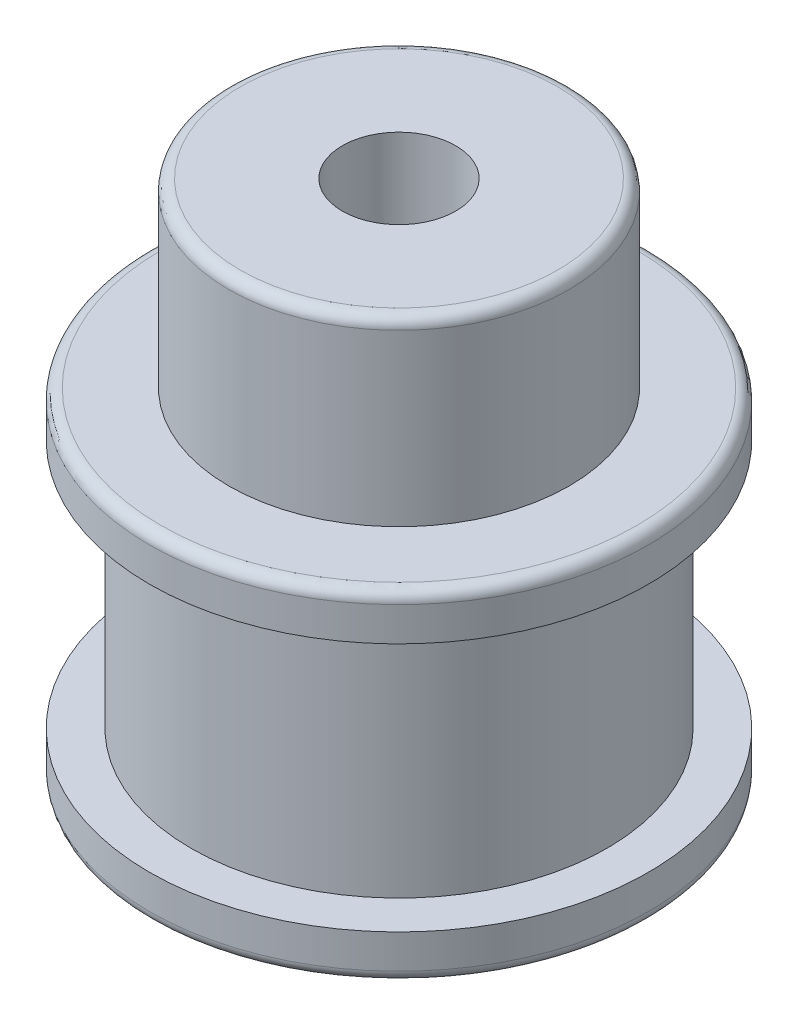
ISO-10303-21;
HEADER;
FILE_DESCRIPTION(('STEP AP214'),'2;1');
FILE_NAME('part.step','',(''),(''),'','','');
FILE_SCHEMA(('AUTOMOTIVE_DESIGN { 1 0 10303 214 1 1 1 1 }'));
ENDSEC;
DATA;
#1=APPLICATION_CONTEXT('core data for automotive mechanical design processes');
#2=APPLICATION_PROTOCOL_DEFINITION('international standard','automotive_design',2000,#1);
#3=PRODUCT_CONTEXT('',#1,'mechanical');
#4=PRODUCT('Part','Part','',(#3));
#5=PRODUCT_RELATED_PRODUCT_CATEGORY('part','',(#4));
#6=PRODUCT_DEFINITION_FORMATION('','',#4);
#7=PRODUCT_DEFINITION_CONTEXT('part definition',#1,'design');
#8=PRODUCT_DEFINITION('design','',#6,#7);
#9=PRODUCT_DEFINITION_SHAPE('','',#8);
#10=(LENGTH_UNIT() NAMED_UNIT(*) SI_UNIT(.MILLI.,.METRE.));
#11=(NAMED_UNIT(*) PLANE_ANGLE_UNIT() SI_UNIT($,.RADIAN.));
#12=(NAMED_UNIT(*) SI_UNIT($,.STERADIAN.) SOLID_ANGLE_UNIT());
#13=UNCERTAINTY_MEASURE_WITH_UNIT(LENGTH_MEASURE(1.E-05),#10,'distance_accuracy_value','');
#14=(GEOMETRIC_REPRESENTATION_CONTEXT(3) GLOBAL_UNCERTAINTY_ASSIGNED_CONTEXT((#13)) GLOBAL_UNIT_ASSIGNED_CONTEXT((#10,
#11,#12)) REPRESENTATION_CONTEXT('',''));
#15=CARTESIAN_POINT('',(0.,0.,0.));
#16=DIRECTION('',(0.,0.,1.));
#17=DIRECTION('',(1.,0.,0.));
#18=AXIS2_PLACEMENT_3D('',#15,#16,#17);
#19=CARTESIAN_POINT('',(0.,15.,0.));
#20=DIRECTION('',(0.,-1.,0.));
#21=DIRECTION('',(0.,0.,-1.));
#22=AXIS2_PLACEMENT_3D('',#19,#20,#21);
#23=CYLINDRICAL_SURFACE('',#22,11.);
#24=CARTESIAN_POINT('',(0.,0.5,0.));
#25=DIRECTION('',(0.,1.,0.));
#26=DIRECTION('',(0.,0.,1.));
#27=AXIS2_PLACEMENT_3D('',#24,#25,#26);
#28=CIRCLE('',#27,11.);
#29=CARTESIAN_POINT('',(0.,0.5,11.));
#30=VERTEX_POINT('',#29);
#31=EDGE_CURVE('E54',#30,#30,#28,.T.);
#32=ORIENTED_EDGE('',*,*,#31,.T.);
#33=EDGE_LOOP('',(#32));
#34=FACE_BOUND('',#33,.T.);
#35=CARTESIAN_POINT('',(0.,2.,0.));
#36=DIRECTION('',(0.,1.,0.));
#37=DIRECTION('',(0.,0.,1.));
#38=AXIS2_PLACEMENT_3D('',#35,#36,#37);
#39=CIRCLE('',#38,11.);
#40=CARTESIAN_POINT('',(0.,2.,11.));
#41=VERTEX_POINT('',#40);
#42=EDGE_CURVE('E67',#41,#41,#39,.T.);
#43=ORIENTED_EDGE('',*,*,#42,.F.);
#44=EDGE_LOOP('',(#43));
#45=FACE_BOUND('',#44,.T.);
#46=ADVANCED_FACE('F31',(#34,#45),#23,.T.);
#47=CARTESIAN_POINT('',(0.,15.,0.));
#48=DIRECTION('',(0.,1.,0.));
#49=DIRECTION('',(0.,0.,1.));
#50=AXIS2_PLACEMENT_3D('',#47,#48,#49);
#51=PLANE('',#50);
#52=CARTESIAN_POINT('',(0.,15.,0.));
#53=DIRECTION('',(0.,1.,0.));
#54=DIRECTION('',(0.,0.,1.));
#55=AXIS2_PLACEMENT_3D('',#52,#53,#54);
#56=CIRCLE('',#55,10.5);
#57=CARTESIAN_POINT('',(0.,15.,10.5));
#58=VERTEX_POINT('',#57);
#59=EDGE_CURVE('E46',#58,#58,#56,.T.);
#60=ORIENTED_EDGE('',*,*,#59,.T.);
#61=EDGE_LOOP('',(#60));
#62=FACE_BOUND('',#61,.T.);
#63=CARTESIAN_POINT('',(0.,15.,0.));
#64=DIRECTION('',(0.,1.,0.));
#65=DIRECTION('',(0.,0.,1.));
#66=AXIS2_PLACEMENT_3D('',#63,#64,#65);
#67=CIRCLE('',#66,7.5);
#68=CARTESIAN_POINT('',(0.,15.,7.5));
#69=VERTEX_POINT('',#68);
#70=EDGE_CURVE('E57',#69,#69,#67,.T.);
#71=ORIENTED_EDGE('',*,*,#70,.F.);
#72=EDGE_LOOP('',(#71));
#73=FACE_BOUND('',#72,.T.);
#74=ADVANCED_FACE('F100',(#62,#73),#51,.T.);
#75=CARTESIAN_POINT('',(0.,0.,0.));
#76=DIRECTION('',(0.,1.,0.));
#77=DIRECTION('',(0.,0.,1.));
#78=AXIS2_PLACEMENT_3D('',#75,#76,#77);
#79=PLANE('',#78);
#80=CARTESIAN_POINT('',(0.,0.,0.));
#81=DIRECTION('',(0.,1.,0.));
#82=DIRECTION('',(0.,0.,1.));
#83=AXIS2_PLACEMENT_3D('',#80,#81,#82);
#84=CIRCLE('',#83,10.5);
#85=CARTESIAN_POINT('',(0.,0.,10.5));
#86=VERTEX_POINT('',#85);
#87=EDGE_CURVE('E51',#86,#86,#84,.F.);
#88=ORIENTED_EDGE('',*,*,#87,.T.);
#89=EDGE_LOOP('',(#88));
#90=FACE_BOUND('',#89,.T.);
#91=CARTESIAN_POINT('',(0.,0.,0.));
#92=DIRECTION('',(0.,1.,0.));
#93=DIRECTION('',(0.,0.,1.));
#94=AXIS2_PLACEMENT_3D('',#91,#92,#93);
#95=CIRCLE('',#94,2.5);
#96=CARTESIAN_POINT('',(0.,0.,2.5));
#97=VERTEX_POINT('',#96);
#98=EDGE_CURVE('E58',#97,#97,#95,.T.);
#99=ORIENTED_EDGE('',*,*,#98,.T.);
#100=EDGE_LOOP('',(#99));
#101=FACE_BOUND('',#100,.T.);
#102=ADVANCED_FACE('F108',(#90,#101),#79,.F.);
#103=CARTESIAN_POINT('',(0.,14.5,0.));
#104=DIRECTION('',(0.,1.,0.));
#105=DIRECTION('',(0.,0.,1.));
#106=AXIS2_PLACEMENT_3D('',#103,#104,#105);
#107=CIRCLE('',#106,11.);
#108=CARTESIAN_POINT('',(0.,14.5,11.));
#109=VERTEX_POINT('',#108);
#110=EDGE_CURVE('E42',#109,#109,#107,.F.);
#111=ORIENTED_EDGE('',*,*,#110,.T.);
#112=EDGE_LOOP('',(#111));
#113=FACE_BOUND('',#112,.T.);
#114=CARTESIAN_POINT('',(0.,13.,0.));
#115=DIRECTION('',(0.,1.,0.));
#116=DIRECTION('',(0.,0.,1.));
#117=AXIS2_PLACEMENT_3D('',#114,#115,#116);
#118=CIRCLE('',#117,11.);
#119=CARTESIAN_POINT('',(0.,13.,11.));
#120=VERTEX_POINT('',#119);
#121=EDGE_CURVE('E66',#120,#120,#118,.T.);
#122=ORIENTED_EDGE('',*,*,#121,.T.);
#123=EDGE_LOOP('',(#122));
#124=FACE_BOUND('',#123,.T.);
#125=ADVANCED_FACE('F103',(#113,#124),#23,.T.);
#126=CARTESIAN_POINT('',(0.,15.,0.));
#127=DIRECTION('',(0.,-1.,0.));
#128=DIRECTION('',(0.,0.,-1.));
#129=AXIS2_PLACEMENT_3D('',#126,#127,#128);
#130=CYLINDRICAL_SURFACE('',#129,2.5);
#131=ORIENTED_EDGE('',*,*,#98,.F.);
#132=EDGE_LOOP('',(#131));
#133=FACE_BOUND('',#132,.T.);
#134=CARTESIAN_POINT('',(0.,23.,0.));
#135=DIRECTION('',(0.,1.,0.));
#136=DIRECTION('',(0.,0.,1.));
#137=AXIS2_PLACEMENT_3D('',#134,#135,#136);
#138=CIRCLE('',#137,2.5);
#139=CARTESIAN_POINT('',(0.,23.,2.5));
#140=VERTEX_POINT('',#139);
#141=EDGE_CURVE('E61',#140,#140,#138,.T.);
#142=ORIENTED_EDGE('',*,*,#141,.T.);
#143=EDGE_LOOP('',(#142));
#144=FACE_BOUND('',#143,.T.);
#145=ADVANCED_FACE('F115',(#133,#144),#130,.F.);
#146=CARTESIAN_POINT('',(0.,23.,0.));
#147=DIRECTION('',(0.,1.,0.));
#148=DIRECTION('',(0.,0.,1.));
#149=AXIS2_PLACEMENT_3D('',#146,#147,#148);
#150=PLANE('',#149);
#151=CARTESIAN_POINT('',(0.,23.,0.));
#152=DIRECTION('',(0.,1.,0.));
#153=DIRECTION('',(0.,0.,1.));
#154=AXIS2_PLACEMENT_3D('',#151,#152,#153);
#155=CIRCLE('',#154,7.);
#156=CARTESIAN_POINT('',(0.,23.,7.));
#157=VERTEX_POINT('',#156);
#158=EDGE_CURVE('E38',#157,#157,#155,.T.);
#159=ORIENTED_EDGE('',*,*,#158,.T.);
#160=EDGE_LOOP('',(#159));
#161=FACE_BOUND('',#160,.T.);
#162=ORIENTED_EDGE('',*,*,#141,.F.);
#163=EDGE_LOOP('',(#162));
#164=FACE_BOUND('',#163,.T.);
#165=ADVANCED_FACE('F122',(#161,#164),#150,.T.);
#166=CARTESIAN_POINT('',(0.,23.,0.));
#167=DIRECTION('',(0.,-1.,0.));
#168=DIRECTION('',(0.,0.,-1.));
#169=AXIS2_PLACEMENT_3D('',#166,#167,#168);
#170=CYLINDRICAL_SURFACE('',#169,7.5);
#171=CARTESIAN_POINT('',(0.,22.5,0.));
#172=DIRECTION('',(0.,1.,0.));
#173=DIRECTION('',(0.,0.,1.));
#174=AXIS2_PLACEMENT_3D('',#171,#172,#173);
#175=CIRCLE('',#174,7.5);
#176=CARTESIAN_POINT('',(0.,22.5,7.5));
#177=VERTEX_POINT('',#176);
#178=EDGE_CURVE('E10',#177,#177,#175,.F.);
#179=ORIENTED_EDGE('',*,*,#178,.T.);
#180=EDGE_LOOP('',(#179));
#181=FACE_BOUND('',#180,.T.);
#182=ORIENTED_EDGE('',*,*,#70,.T.);
#183=EDGE_LOOP('',(#182));
#184=FACE_BOUND('',#183,.T.);
#185=ADVANCED_FACE('F95',(#181,#184),#170,.T.);
#186=CARTESIAN_POINT('',(0.,13.,0.));
#187=DIRECTION('',(0.,1.,0.));
#188=DIRECTION('',(0.,0.,1.));
#189=AXIS2_PLACEMENT_3D('',#186,#187,#188);
#190=PLANE('',#189);
#191=ORIENTED_EDGE('',*,*,#121,.F.);
#192=EDGE_LOOP('',(#191));
#193=FACE_BOUND('',#192,.T.);
#194=CARTESIAN_POINT('',(0.,13.,0.));
#195=DIRECTION('',(0.,1.,0.));
#196=DIRECTION('',(0.,0.,1.));
#197=AXIS2_PLACEMENT_3D('',#194,#195,#196);
#198=CIRCLE('',#197,9.17);
#199=CARTESIAN_POINT('',(0.,13.,9.17));
#200=VERTEX_POINT('',#199);
#201=EDGE_CURVE('E70',#200,#200,#198,.T.);
#202=ORIENTED_EDGE('',*,*,#201,.T.);
#203=EDGE_LOOP('',(#202));
#204=FACE_BOUND('',#203,.T.);
#205=ADVANCED_FACE('F79',(#193,#204),#190,.F.);
#206=CARTESIAN_POINT('',(0.,2.,0.));
#207=DIRECTION('',(0.,1.,0.));
#208=DIRECTION('',(0.,0.,1.));
#209=AXIS2_PLACEMENT_3D('',#206,#207,#208);
#210=PLANE('',#209);
#211=ORIENTED_EDGE('',*,*,#42,.T.);
#212=EDGE_LOOP('',(#211));
#213=FACE_BOUND('',#212,.T.);
#214=CARTESIAN_POINT('',(0.,2.,0.));
#215=DIRECTION('',(0.,1.,0.));
#216=DIRECTION('',(0.,0.,1.));
#217=AXIS2_PLACEMENT_3D('',#214,#215,#216);
#218=CIRCLE('',#217,9.17);
#219=CARTESIAN_POINT('',(0.,2.,9.17));
#220=VERTEX_POINT('',#219);
#221=EDGE_CURVE('E73',#220,#220,#218,.T.);
#222=ORIENTED_EDGE('',*,*,#221,.F.);
#223=EDGE_LOOP('',(#222));
#224=FACE_BOUND('',#223,.T.);
#225=ADVANCED_FACE('F85',(#213,#224),#210,.T.);
#226=CARTESIAN_POINT('',(0.,13.,0.));
#227=DIRECTION('',(0.,-1.,0.));
#228=DIRECTION('',(0.,0.,-1.));
#229=AXIS2_PLACEMENT_3D('',#226,#227,#228);
#230=CYLINDRICAL_SURFACE('',#229,9.17);
#231=ORIENTED_EDGE('',*,*,#201,.F.);
#232=EDGE_LOOP('',(#231));
#233=FACE_BOUND('',#232,.T.);
#234=ORIENTED_EDGE('',*,*,#221,.T.);
#235=EDGE_LOOP('',(#234));
#236=FACE_BOUND('',#235,.T.);
#237=ADVANCED_FACE('F81',(#233,#236),#230,.T.);
#238=CARTESIAN_POINT('',(0.,0.5,0.));
#239=DIRECTION('',(0.,1.,0.));
#240=DIRECTION('',(0.,0.,1.));
#241=AXIS2_PLACEMENT_3D('',#238,#239,#240);
#242=TOROIDAL_SURFACE('',#241,10.5,0.5);
#243=ORIENTED_EDGE('',*,*,#87,.F.);
#244=EDGE_LOOP('',(#243));
#245=FACE_BOUND('',#244,.T.);
#246=ORIENTED_EDGE('',*,*,#31,.F.);
#247=EDGE_LOOP('',(#246));
#248=FACE_BOUND('',#247,.T.);
#249=ADVANCED_FACE('F84',(#245,#248),#242,.T.);
#250=CARTESIAN_POINT('',(0.,14.5,0.));
#251=DIRECTION('',(0.,1.,0.));
#252=DIRECTION('',(0.,0.,1.));
#253=AXIS2_PLACEMENT_3D('',#250,#251,#252);
#254=TOROIDAL_SURFACE('',#253,10.5,0.5);
#255=ORIENTED_EDGE('',*,*,#110,.F.);
#256=EDGE_LOOP('',(#255));
#257=FACE_BOUND('',#256,.T.);
#258=ORIENTED_EDGE('',*,*,#59,.F.);
#259=EDGE_LOOP('',(#258));
#260=FACE_BOUND('',#259,.T.);
#261=ADVANCED_FACE('F130',(#257,#260),#254,.T.);
#262=CARTESIAN_POINT('',(0.,22.5,0.));
#263=DIRECTION('',(0.,1.,0.));
#264=DIRECTION('',(0.,0.,1.));
#265=AXIS2_PLACEMENT_3D('',#262,#263,#264);
#266=TOROIDAL_SURFACE('',#265,7.,0.5);
#267=ORIENTED_EDGE('',*,*,#178,.F.);
#268=EDGE_LOOP('',(#267));
#269=FACE_BOUND('',#268,.T.);
#270=ORIENTED_EDGE('',*,*,#158,.F.);
#271=EDGE_LOOP('',(#270));
#272=FACE_BOUND('',#271,.T.);
#273=ADVANCED_FACE('F33',(#269,#272),#266,.T.);
#274=CLOSED_SHELL('',(#46,#74,#102,#125,#145,#165,#185,#205,#225,#237,#249,#261,#273));
#275=MANIFOLD_SOLID_BREP('B2',#274);
#276=ADVANCED_BREP_SHAPE_REPRESENTATION('',(#18,#275),#14);
#277=SHAPE_DEFINITION_REPRESENTATION(#9,#276);
ENDSEC;
END-ISO-10303-21;
